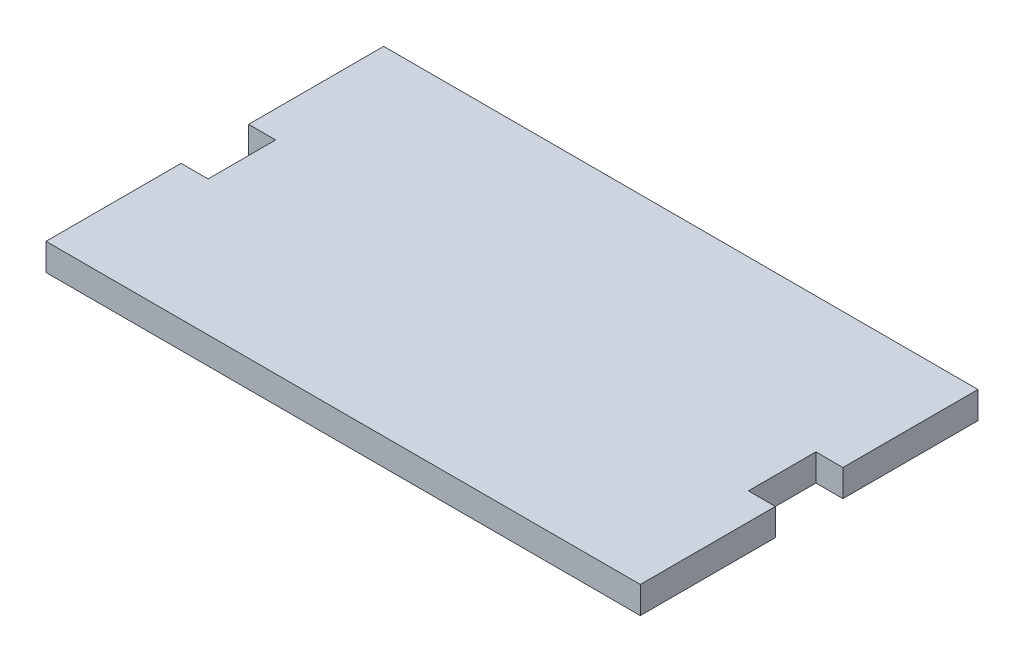
ISO-10303-21;
HEADER;
FILE_DESCRIPTION(('STEP AP214'),'2;1');
FILE_NAME('part.step','',(''),(''),'','','');
FILE_SCHEMA(('AUTOMOTIVE_DESIGN { 1 0 10303 214 1 1 1 1 }'));
ENDSEC;
DATA;
#1=APPLICATION_CONTEXT('core data for automotive mechanical design processes');
#2=APPLICATION_PROTOCOL_DEFINITION('international standard','automotive_design',2000,#1);
#3=PRODUCT_CONTEXT('',#1,'mechanical');
#4=PRODUCT('Part','Part','',(#3));
#5=PRODUCT_RELATED_PRODUCT_CATEGORY('part','',(#4));
#6=PRODUCT_DEFINITION_FORMATION('','',#4);
#7=PRODUCT_DEFINITION_CONTEXT('part definition',#1,'design');
#8=PRODUCT_DEFINITION('design','',#6,#7);
#9=PRODUCT_DEFINITION_SHAPE('','',#8);
#10=(LENGTH_UNIT() NAMED_UNIT(*) SI_UNIT(.MILLI.,.METRE.));
#11=(NAMED_UNIT(*) PLANE_ANGLE_UNIT() SI_UNIT($,.RADIAN.));
#12=(NAMED_UNIT(*) SI_UNIT($,.STERADIAN.) SOLID_ANGLE_UNIT());
#13=UNCERTAINTY_MEASURE_WITH_UNIT(LENGTH_MEASURE(1.E-05),#10,'distance_accuracy_value','');
#14=(GEOMETRIC_REPRESENTATION_CONTEXT(3) GLOBAL_UNCERTAINTY_ASSIGNED_CONTEXT((#13)) GLOBAL_UNIT_ASSIGNED_CONTEXT((#10,
#11,#12)) REPRESENTATION_CONTEXT('',''));
#15=CARTESIAN_POINT('',(0.,0.,0.));
#16=DIRECTION('',(0.,0.,1.));
#17=DIRECTION('',(1.,0.,0.));
#18=AXIS2_PLACEMENT_3D('',#15,#16,#17);
#19=CARTESIAN_POINT('',(0.,4.,0.));
#20=DIRECTION('',(-1.,0.,0.));
#21=DIRECTION('',(0.,0.,1.));
#22=AXIS2_PLACEMENT_3D('',#19,#20,#21);
#23=PLANE('',#22);
#24=DIRECTION('',(0.,0.,-1.));
#25=VECTOR('',#24,1.);
#26=CARTESIAN_POINT('',(0.,0.,0.));
#27=LINE('',#26,#25);
#28=CARTESIAN_POINT('',(0.,0.,0.));
#29=VERTEX_POINT('',#28);
#30=CARTESIAN_POINT('',(0.,0.,-20.));
#31=VERTEX_POINT('',#30);
#32=EDGE_CURVE('E164',#29,#31,#27,.T.);
#33=ORIENTED_EDGE('',*,*,#32,.T.);
#34=DIRECTION('',(0.,-1.,0.));
#35=VECTOR('',#34,1.);
#36=CARTESIAN_POINT('',(0.,4.,-20.));
#37=LINE('',#36,#35);
#38=CARTESIAN_POINT('',(0.,4.,-20.));
#39=VERTEX_POINT('',#38);
#40=EDGE_CURVE('E11',#39,#31,#37,.T.);
#41=ORIENTED_EDGE('',*,*,#40,.F.);
#42=DIRECTION('',(0.,0.,-1.));
#43=VECTOR('',#42,1.);
#44=CARTESIAN_POINT('',(0.,4.,0.));
#45=LINE('',#44,#43);
#46=CARTESIAN_POINT('',(0.,4.,0.));
#47=VERTEX_POINT('',#46);
#48=EDGE_CURVE('E198',#47,#39,#45,.T.);
#49=ORIENTED_EDGE('',*,*,#48,.F.);
#50=DIRECTION('',(0.,-1.,0.));
#51=VECTOR('',#50,1.);
#52=CARTESIAN_POINT('',(0.,4.,0.));
#53=LINE('',#52,#51);
#54=EDGE_CURVE('E160',#47,#29,#53,.T.);
#55=ORIENTED_EDGE('',*,*,#54,.T.);
#56=EDGE_LOOP('',(#33,#41,#49,#55));
#57=FACE_BOUND('',#56,.T.);
#58=ADVANCED_FACE('F39',(#57),#23,.F.);
#59=CARTESIAN_POINT('',(-4.,4.,-20.));
#60=DIRECTION('',(0.,0.,1.));
#61=DIRECTION('',(1.,0.,0.));
#62=AXIS2_PLACEMENT_3D('',#59,#60,#61);
#63=PLANE('',#62);
#64=DIRECTION('',(-1.,0.,0.));
#65=VECTOR('',#64,1.);
#66=CARTESIAN_POINT('',(-4.,0.,-20.));
#67=LINE('',#66,#65);
#68=CARTESIAN_POINT('',(-4.,0.,-20.));
#69=VERTEX_POINT('',#68);
#70=EDGE_CURVE('E168',#31,#69,#67,.T.);
#71=ORIENTED_EDGE('',*,*,#70,.T.);
#72=DIRECTION('',(0.,-1.,0.));
#73=VECTOR('',#72,1.);
#74=CARTESIAN_POINT('',(-4.,4.,-20.));
#75=LINE('',#74,#73);
#76=CARTESIAN_POINT('',(-4.,4.,-20.));
#77=VERTEX_POINT('',#76);
#78=EDGE_CURVE('E48',#77,#69,#75,.T.);
#79=ORIENTED_EDGE('',*,*,#78,.F.);
#80=DIRECTION('',(-1.,0.,0.));
#81=VECTOR('',#80,1.);
#82=CARTESIAN_POINT('',(-4.,4.,-20.));
#83=LINE('',#82,#81);
#84=EDGE_CURVE('E111',#39,#77,#83,.T.);
#85=ORIENTED_EDGE('',*,*,#84,.F.);
#86=ORIENTED_EDGE('',*,*,#40,.T.);
#87=EDGE_LOOP('',(#71,#79,#85,#86));
#88=FACE_BOUND('',#87,.T.);
#89=ADVANCED_FACE('F292',(#88),#63,.F.);
#90=CARTESIAN_POINT('',(-4.,4.,-30.));
#91=DIRECTION('',(-1.,0.,0.));
#92=DIRECTION('',(0.,0.,1.));
#93=AXIS2_PLACEMENT_3D('',#90,#91,#92);
#94=PLANE('',#93);
#95=DIRECTION('',(0.,0.,-1.));
#96=VECTOR('',#95,1.);
#97=CARTESIAN_POINT('',(-4.,0.,-30.));
#98=LINE('',#97,#96);
#99=CARTESIAN_POINT('',(-4.,0.,-30.));
#100=VERTEX_POINT('',#99);
#101=EDGE_CURVE('E171',#69,#100,#98,.T.);
#102=ORIENTED_EDGE('',*,*,#101,.T.);
#103=DIRECTION('',(0.,-1.,0.));
#104=VECTOR('',#103,1.);
#105=CARTESIAN_POINT('',(-4.,4.,-30.));
#106=LINE('',#105,#104);
#107=CARTESIAN_POINT('',(-4.,4.,-30.));
#108=VERTEX_POINT('',#107);
#109=EDGE_CURVE('E225',#108,#100,#106,.T.);
#110=ORIENTED_EDGE('',*,*,#109,.F.);
#111=DIRECTION('',(0.,0.,-1.));
#112=VECTOR('',#111,1.);
#113=CARTESIAN_POINT('',(-4.,4.,-30.));
#114=LINE('',#113,#112);
#115=EDGE_CURVE('E235',#77,#108,#114,.T.);
#116=ORIENTED_EDGE('',*,*,#115,.F.);
#117=ORIENTED_EDGE('',*,*,#78,.T.);
#118=EDGE_LOOP('',(#102,#110,#116,#117));
#119=FACE_BOUND('',#118,.T.);
#120=ADVANCED_FACE('F233',(#119),#94,.F.);
#121=CARTESIAN_POINT('',(-4.,4.,-30.));
#122=DIRECTION('',(0.,0.,-1.));
#123=DIRECTION('',(-1.,0.,0.));
#124=AXIS2_PLACEMENT_3D('',#121,#122,#123);
#125=PLANE('',#124);
#126=DIRECTION('',(1.,0.,0.));
#127=VECTOR('',#126,1.);
#128=CARTESIAN_POINT('',(-4.,0.,-30.));
#129=LINE('',#128,#127);
#130=CARTESIAN_POINT('',(0.,0.,-30.));
#131=VERTEX_POINT('',#130);
#132=EDGE_CURVE('E174',#100,#131,#129,.T.);
#133=ORIENTED_EDGE('',*,*,#132,.T.);
#134=DIRECTION('',(0.,-1.,0.));
#135=VECTOR('',#134,1.);
#136=CARTESIAN_POINT('',(0.,4.,-30.));
#137=LINE('',#136,#135);
#138=CARTESIAN_POINT('',(0.,4.,-30.));
#139=VERTEX_POINT('',#138);
#140=EDGE_CURVE('E221',#139,#131,#137,.T.);
#141=ORIENTED_EDGE('',*,*,#140,.F.);
#142=DIRECTION('',(1.,0.,0.));
#143=VECTOR('',#142,1.);
#144=CARTESIAN_POINT('',(-4.,4.,-30.));
#145=LINE('',#144,#143);
#146=EDGE_CURVE('E254',#108,#139,#145,.T.);
#147=ORIENTED_EDGE('',*,*,#146,.F.);
#148=ORIENTED_EDGE('',*,*,#109,.T.);
#149=EDGE_LOOP('',(#133,#141,#147,#148));
#150=FACE_BOUND('',#149,.T.);
#151=ADVANCED_FACE('F244',(#150),#125,.F.);
#152=CARTESIAN_POINT('',(0.,4.,-30.));
#153=DIRECTION('',(-1.,0.,0.));
#154=DIRECTION('',(0.,0.,1.));
#155=AXIS2_PLACEMENT_3D('',#152,#153,#154);
#156=PLANE('',#155);
#157=DIRECTION('',(0.,0.,-1.));
#158=VECTOR('',#157,1.);
#159=CARTESIAN_POINT('',(0.,0.,-30.));
#160=LINE('',#159,#158);
#161=CARTESIAN_POINT('',(0.,0.,-50.));
#162=VERTEX_POINT('',#161);
#163=EDGE_CURVE('E177',#131,#162,#160,.T.);
#164=ORIENTED_EDGE('',*,*,#163,.T.);
#165=DIRECTION('',(0.,-1.,0.));
#166=VECTOR('',#165,1.);
#167=CARTESIAN_POINT('',(0.,4.,-50.));
#168=LINE('',#167,#166);
#169=CARTESIAN_POINT('',(0.,4.,-50.));
#170=VERTEX_POINT('',#169);
#171=EDGE_CURVE('E217',#170,#162,#168,.T.);
#172=ORIENTED_EDGE('',*,*,#171,.F.);
#173=DIRECTION('',(0.,0.,-1.));
#174=VECTOR('',#173,1.);
#175=CARTESIAN_POINT('',(0.,4.,-30.));
#176=LINE('',#175,#174);
#177=EDGE_CURVE('E250',#139,#170,#176,.T.);
#178=ORIENTED_EDGE('',*,*,#177,.F.);
#179=ORIENTED_EDGE('',*,*,#140,.T.);
#180=EDGE_LOOP('',(#164,#172,#178,#179));
#181=FACE_BOUND('',#180,.T.);
#182=ADVANCED_FACE('F248',(#181),#156,.F.);
#183=CARTESIAN_POINT('',(0.,4.,-50.));
#184=DIRECTION('',(0.,0.,1.));
#185=DIRECTION('',(1.,0.,0.));
#186=AXIS2_PLACEMENT_3D('',#183,#184,#185);
#187=PLANE('',#186);
#188=DIRECTION('',(-1.,0.,0.));
#189=VECTOR('',#188,1.);
#190=CARTESIAN_POINT('',(0.,0.,-50.));
#191=LINE('',#190,#189);
#192=CARTESIAN_POINT('',(-88.,0.,-50.));
#193=VERTEX_POINT('',#192);
#194=EDGE_CURVE('E180',#162,#193,#191,.T.);
#195=ORIENTED_EDGE('',*,*,#194,.T.);
#196=DIRECTION('',(0.,-1.,0.));
#197=VECTOR('',#196,1.);
#198=CARTESIAN_POINT('',(-88.,4.,-50.));
#199=LINE('',#198,#197);
#200=CARTESIAN_POINT('',(-88.,4.,-50.));
#201=VERTEX_POINT('',#200);
#202=EDGE_CURVE('E213',#201,#193,#199,.T.);
#203=ORIENTED_EDGE('',*,*,#202,.F.);
#204=DIRECTION('',(-1.,0.,0.));
#205=VECTOR('',#204,1.);
#206=CARTESIAN_POINT('',(0.,4.,-50.));
#207=LINE('',#206,#205);
#208=EDGE_CURVE('E253',#170,#201,#207,.T.);
#209=ORIENTED_EDGE('',*,*,#208,.F.);
#210=ORIENTED_EDGE('',*,*,#171,.T.);
#211=EDGE_LOOP('',(#195,#203,#209,#210));
#212=FACE_BOUND('',#211,.T.);
#213=ADVANCED_FACE('F305',(#212),#187,.F.);
#214=CARTESIAN_POINT('',(-88.,4.,-30.));
#215=DIRECTION('',(1.,0.,0.));
#216=DIRECTION('',(0.,0.,-1.));
#217=AXIS2_PLACEMENT_3D('',#214,#215,#216);
#218=PLANE('',#217);
#219=DIRECTION('',(0.,0.,1.));
#220=VECTOR('',#219,1.);
#221=CARTESIAN_POINT('',(-88.,0.,-30.));
#222=LINE('',#221,#220);
#223=CARTESIAN_POINT('',(-88.,0.,-30.));
#224=VERTEX_POINT('',#223);
#225=EDGE_CURVE('E183',#193,#224,#222,.T.);
#226=ORIENTED_EDGE('',*,*,#225,.T.);
#227=DIRECTION('',(0.,-1.,0.));
#228=VECTOR('',#227,1.);
#229=CARTESIAN_POINT('',(-88.,4.,-30.));
#230=LINE('',#229,#228);
#231=CARTESIAN_POINT('',(-88.,4.,-30.));
#232=VERTEX_POINT('',#231);
#233=EDGE_CURVE('E209',#232,#224,#230,.T.);
#234=ORIENTED_EDGE('',*,*,#233,.F.);
#235=DIRECTION('',(0.,0.,1.));
#236=VECTOR('',#235,1.);
#237=CARTESIAN_POINT('',(-88.,4.,-30.));
#238=LINE('',#237,#236);
#239=EDGE_CURVE('E258',#201,#232,#238,.T.);
#240=ORIENTED_EDGE('',*,*,#239,.F.);
#241=ORIENTED_EDGE('',*,*,#202,.T.);
#242=EDGE_LOOP('',(#226,#234,#240,#241));
#243=FACE_BOUND('',#242,.T.);
#244=ADVANCED_FACE('F308',(#243),#218,.F.);
#245=CARTESIAN_POINT('',(-84.,4.,-30.));
#246=DIRECTION('',(0.,0.,-1.));
#247=DIRECTION('',(-1.,0.,0.));
#248=AXIS2_PLACEMENT_3D('',#245,#246,#247);
#249=PLANE('',#248);
#250=DIRECTION('',(1.,0.,0.));
#251=VECTOR('',#250,1.);
#252=CARTESIAN_POINT('',(-84.,0.,-30.));
#253=LINE('',#252,#251);
#254=CARTESIAN_POINT('',(-84.,0.,-30.));
#255=VERTEX_POINT('',#254);
#256=EDGE_CURVE('E186',#224,#255,#253,.T.);
#257=ORIENTED_EDGE('',*,*,#256,.T.);
#258=DIRECTION('',(0.,-1.,0.));
#259=VECTOR('',#258,1.);
#260=CARTESIAN_POINT('',(-84.,4.,-30.));
#261=LINE('',#260,#259);
#262=CARTESIAN_POINT('',(-84.,4.,-30.));
#263=VERTEX_POINT('',#262);
#264=EDGE_CURVE('E205',#263,#255,#261,.T.);
#265=ORIENTED_EDGE('',*,*,#264,.F.);
#266=DIRECTION('',(1.,0.,0.));
#267=VECTOR('',#266,1.);
#268=CARTESIAN_POINT('',(-84.,4.,-30.));
#269=LINE('',#268,#267);
#270=EDGE_CURVE('E265',#232,#263,#269,.T.);
#271=ORIENTED_EDGE('',*,*,#270,.F.);
#272=ORIENTED_EDGE('',*,*,#233,.T.);
#273=EDGE_LOOP('',(#257,#265,#271,#272));
#274=FACE_BOUND('',#273,.T.);
#275=ADVANCED_FACE('F273',(#274),#249,.F.);
#276=CARTESIAN_POINT('',(-84.,4.,-30.));
#277=DIRECTION('',(1.,0.,0.));
#278=DIRECTION('',(0.,0.,-1.));
#279=AXIS2_PLACEMENT_3D('',#276,#277,#278);
#280=PLANE('',#279);
#281=DIRECTION('',(0.,0.,1.));
#282=VECTOR('',#281,1.);
#283=CARTESIAN_POINT('',(-84.,0.,-30.));
#284=LINE('',#283,#282);
#285=CARTESIAN_POINT('',(-84.,0.,-20.));
#286=VERTEX_POINT('',#285);
#287=EDGE_CURVE('E189',#255,#286,#284,.T.);
#288=ORIENTED_EDGE('',*,*,#287,.T.);
#289=DIRECTION('',(0.,-1.,0.));
#290=VECTOR('',#289,1.);
#291=CARTESIAN_POINT('',(-84.,4.,-20.));
#292=LINE('',#291,#290);
#293=CARTESIAN_POINT('',(-84.,4.,-20.));
#294=VERTEX_POINT('',#293);
#295=EDGE_CURVE('E153',#294,#286,#292,.T.);
#296=ORIENTED_EDGE('',*,*,#295,.F.);
#297=DIRECTION('',(0.,0.,1.));
#298=VECTOR('',#297,1.);
#299=CARTESIAN_POINT('',(-84.,4.,-30.));
#300=LINE('',#299,#298);
#301=EDGE_CURVE('E142',#263,#294,#300,.T.);
#302=ORIENTED_EDGE('',*,*,#301,.F.);
#303=ORIENTED_EDGE('',*,*,#264,.T.);
#304=EDGE_LOOP('',(#288,#296,#302,#303));
#305=FACE_BOUND('',#304,.T.);
#306=ADVANCED_FACE('F277',(#305),#280,.F.);
#307=CARTESIAN_POINT('',(-84.,4.,-20.));
#308=DIRECTION('',(0.,0.,1.));
#309=DIRECTION('',(1.,0.,0.));
#310=AXIS2_PLACEMENT_3D('',#307,#308,#309);
#311=PLANE('',#310);
#312=DIRECTION('',(-1.,0.,0.));
#313=VECTOR('',#312,1.);
#314=CARTESIAN_POINT('',(-84.,0.,-20.));
#315=LINE('',#314,#313);
#316=CARTESIAN_POINT('',(-88.,0.,-20.));
#317=VERTEX_POINT('',#316);
#318=EDGE_CURVE('E151',#286,#317,#315,.T.);
#319=ORIENTED_EDGE('',*,*,#318,.T.);
#320=DIRECTION('',(0.,-1.,0.));
#321=VECTOR('',#320,1.);
#322=CARTESIAN_POINT('',(-88.,4.,-20.));
#323=LINE('',#322,#321);
#324=CARTESIAN_POINT('',(-88.,4.,-20.));
#325=VERTEX_POINT('',#324);
#326=EDGE_CURVE('E148',#325,#317,#323,.T.);
#327=ORIENTED_EDGE('',*,*,#326,.F.);
#328=DIRECTION('',(-1.,0.,0.));
#329=VECTOR('',#328,1.);
#330=CARTESIAN_POINT('',(-84.,4.,-20.));
#331=LINE('',#330,#329);
#332=EDGE_CURVE('E136',#294,#325,#331,.T.);
#333=ORIENTED_EDGE('',*,*,#332,.F.);
#334=ORIENTED_EDGE('',*,*,#295,.T.);
#335=EDGE_LOOP('',(#319,#327,#333,#334));
#336=FACE_BOUND('',#335,.T.);
#337=ADVANCED_FACE('F149',(#336),#311,.F.);
#338=CARTESIAN_POINT('',(-88.,4.,0.));
#339=DIRECTION('',(1.,0.,0.));
#340=DIRECTION('',(0.,0.,-1.));
#341=AXIS2_PLACEMENT_3D('',#338,#339,#340);
#342=PLANE('',#341);
#343=DIRECTION('',(0.,0.,1.));
#344=VECTOR('',#343,1.);
#345=CARTESIAN_POINT('',(-88.,0.,0.));
#346=LINE('',#345,#344);
#347=CARTESIAN_POINT('',(-88.,0.,0.));
#348=VERTEX_POINT('',#347);
#349=EDGE_CURVE('E97',#317,#348,#346,.T.);
#350=ORIENTED_EDGE('',*,*,#349,.T.);
#351=DIRECTION('',(0.,-1.,0.));
#352=VECTOR('',#351,1.);
#353=CARTESIAN_POINT('',(-88.,4.,0.));
#354=LINE('',#353,#352);
#355=CARTESIAN_POINT('',(-88.,4.,0.));
#356=VERTEX_POINT('',#355);
#357=EDGE_CURVE('E154',#356,#348,#354,.T.);
#358=ORIENTED_EDGE('',*,*,#357,.F.);
#359=DIRECTION('',(0.,0.,1.));
#360=VECTOR('',#359,1.);
#361=CARTESIAN_POINT('',(-88.,4.,0.));
#362=LINE('',#361,#360);
#363=EDGE_CURVE('E140',#325,#356,#362,.T.);
#364=ORIENTED_EDGE('',*,*,#363,.F.);
#365=ORIENTED_EDGE('',*,*,#326,.T.);
#366=EDGE_LOOP('',(#350,#358,#364,#365));
#367=FACE_BOUND('',#366,.T.);
#368=ADVANCED_FACE('F156',(#367),#342,.F.);
#369=CARTESIAN_POINT('',(0.,4.,0.));
#370=DIRECTION('',(0.,0.,-1.));
#371=DIRECTION('',(-1.,0.,0.));
#372=AXIS2_PLACEMENT_3D('',#369,#370,#371);
#373=PLANE('',#372);
#374=DIRECTION('',(1.,0.,0.));
#375=VECTOR('',#374,1.);
#376=CARTESIAN_POINT('',(0.,0.,0.));
#377=LINE('',#376,#375);
#378=EDGE_CURVE('E103',#348,#29,#377,.T.);
#379=ORIENTED_EDGE('',*,*,#378,.T.);
#380=ORIENTED_EDGE('',*,*,#54,.F.);
#381=DIRECTION('',(1.,0.,0.));
#382=VECTOR('',#381,1.);
#383=CARTESIAN_POINT('',(0.,4.,0.));
#384=LINE('',#383,#382);
#385=EDGE_CURVE('E56',#356,#47,#384,.T.);
#386=ORIENTED_EDGE('',*,*,#385,.F.);
#387=ORIENTED_EDGE('',*,*,#357,.T.);
#388=EDGE_LOOP('',(#379,#380,#386,#387));
#389=FACE_BOUND('',#388,.T.);
#390=ADVANCED_FACE('F281',(#389),#373,.F.);
#391=CARTESIAN_POINT('',(0.,4.,0.));
#392=DIRECTION('',(0.,-1.,0.));
#393=DIRECTION('',(0.,0.,-1.));
#394=AXIS2_PLACEMENT_3D('',#391,#392,#393);
#395=PLANE('',#394);
#396=ORIENTED_EDGE('',*,*,#48,.T.);
#397=ORIENTED_EDGE('',*,*,#84,.T.);
#398=ORIENTED_EDGE('',*,*,#115,.T.);
#399=ORIENTED_EDGE('',*,*,#146,.T.);
#400=ORIENTED_EDGE('',*,*,#177,.T.);
#401=ORIENTED_EDGE('',*,*,#208,.T.);
#402=ORIENTED_EDGE('',*,*,#239,.T.);
#403=ORIENTED_EDGE('',*,*,#270,.T.);
#404=ORIENTED_EDGE('',*,*,#301,.T.);
#405=ORIENTED_EDGE('',*,*,#332,.T.);
#406=ORIENTED_EDGE('',*,*,#363,.T.);
#407=ORIENTED_EDGE('',*,*,#385,.T.);
#408=EDGE_LOOP('',(#396,#397,#398,#399,#400,#401,#402,#403,#404,#405,#406,#407));
#409=FACE_BOUND('',#408,.T.);
#410=ADVANCED_FACE('F138',(#409),#395,.F.);
#411=CARTESIAN_POINT('',(0.,0.,0.));
#412=DIRECTION('',(0.,-1.,0.));
#413=DIRECTION('',(0.,0.,-1.));
#414=AXIS2_PLACEMENT_3D('',#411,#412,#413);
#415=PLANE('',#414);
#416=ORIENTED_EDGE('',*,*,#32,.F.);
#417=ORIENTED_EDGE('',*,*,#378,.F.);
#418=ORIENTED_EDGE('',*,*,#349,.F.);
#419=ORIENTED_EDGE('',*,*,#318,.F.);
#420=ORIENTED_EDGE('',*,*,#287,.F.);
#421=ORIENTED_EDGE('',*,*,#256,.F.);
#422=ORIENTED_EDGE('',*,*,#225,.F.);
#423=ORIENTED_EDGE('',*,*,#194,.F.);
#424=ORIENTED_EDGE('',*,*,#163,.F.);
#425=ORIENTED_EDGE('',*,*,#132,.F.);
#426=ORIENTED_EDGE('',*,*,#101,.F.);
#427=ORIENTED_EDGE('',*,*,#70,.F.);
#428=EDGE_LOOP('',(#416,#417,#418,#419,#420,#421,#422,#423,#424,#425,#426,#427));
#429=FACE_BOUND('',#428,.T.);
#430=ADVANCED_FACE('F239',(#429),#415,.T.);
#431=CLOSED_SHELL('',(#58,#89,#120,#151,#182,#213,#244,#275,#306,#337,#368,#390,#410,#430));
#432=MANIFOLD_SOLID_BREP('B2',#431);
#433=ADVANCED_BREP_SHAPE_REPRESENTATION('',(#18,#432),#14);
#434=SHAPE_DEFINITION_REPRESENTATION(#9,#433);
ENDSEC;
END-ISO-10303-21;
